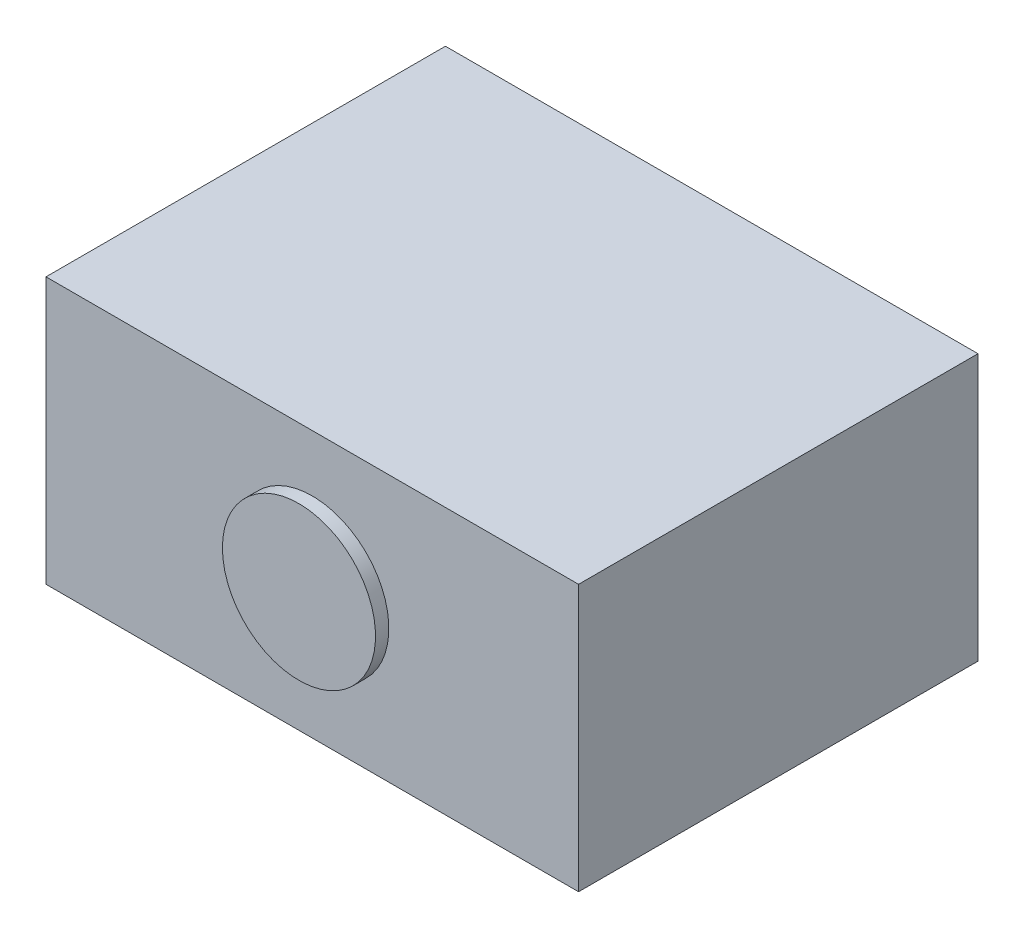
ISO-10303-21;
HEADER;
FILE_DESCRIPTION(('STEP AP214'),'2;1');
FILE_NAME('part.step','',(''),(''),'','','');
FILE_SCHEMA(('AUTOMOTIVE_DESIGN { 1 0 10303 214 1 1 1 1 }'));
ENDSEC;
DATA;
#1=APPLICATION_CONTEXT('core data for automotive mechanical design processes');
#2=APPLICATION_PROTOCOL_DEFINITION('international standard','automotive_design',2000,#1);
#3=PRODUCT_CONTEXT('',#1,'mechanical');
#4=PRODUCT('Part','Part','',(#3));
#5=PRODUCT_RELATED_PRODUCT_CATEGORY('part','',(#4));
#6=PRODUCT_DEFINITION_FORMATION('','',#4);
#7=PRODUCT_DEFINITION_CONTEXT('part definition',#1,'design');
#8=PRODUCT_DEFINITION('design','',#6,#7);
#9=PRODUCT_DEFINITION_SHAPE('','',#8);
#10=(LENGTH_UNIT() NAMED_UNIT(*) SI_UNIT(.MILLI.,.METRE.));
#11=(NAMED_UNIT(*) PLANE_ANGLE_UNIT() SI_UNIT($,.RADIAN.));
#12=(NAMED_UNIT(*) SI_UNIT($,.STERADIAN.) SOLID_ANGLE_UNIT());
#13=UNCERTAINTY_MEASURE_WITH_UNIT(LENGTH_MEASURE(1.E-05),#10,'distance_accuracy_value','');
#14=(GEOMETRIC_REPRESENTATION_CONTEXT(3) GLOBAL_UNCERTAINTY_ASSIGNED_CONTEXT((#13)) GLOBAL_UNIT_ASSIGNED_CONTEXT((#10,
#11,#12)) REPRESENTATION_CONTEXT('',''));
#15=CARTESIAN_POINT('',(0.,0.,0.));
#16=DIRECTION('',(0.,0.,1.));
#17=DIRECTION('',(1.,0.,0.));
#18=AXIS2_PLACEMENT_3D('',#15,#16,#17);
#19=CARTESIAN_POINT('',(200.,-100.,-150.));
#20=DIRECTION('',(1.,0.,0.));
#21=DIRECTION('',(0.,0.,-1.));
#22=AXIS2_PLACEMENT_3D('',#19,#20,#21);
#23=PLANE('',#22);
#24=DIRECTION('',(0.,0.,1.));
#25=VECTOR('',#24,1.);
#26=CARTESIAN_POINT('',(200.,100.,-150.));
#27=LINE('',#26,#25);
#28=CARTESIAN_POINT('',(200.,100.,-150.));
#29=VERTEX_POINT('',#28);
#30=CARTESIAN_POINT('',(200.,100.,150.));
#31=VERTEX_POINT('',#30);
#32=EDGE_CURVE('E73',#29,#31,#27,.T.);
#33=ORIENTED_EDGE('',*,*,#32,.T.);
#34=DIRECTION('',(0.,1.,0.));
#35=VECTOR('',#34,1.);
#36=CARTESIAN_POINT('',(200.,-100.,150.));
#37=LINE('',#36,#35);
#38=CARTESIAN_POINT('',(200.,-100.,150.));
#39=VERTEX_POINT('',#38);
#40=EDGE_CURVE('E76',#39,#31,#37,.T.);
#41=ORIENTED_EDGE('',*,*,#40,.F.);
#42=DIRECTION('',(0.,0.,1.));
#43=VECTOR('',#42,1.);
#44=CARTESIAN_POINT('',(200.,-100.,-150.));
#45=LINE('',#44,#43);
#46=CARTESIAN_POINT('',(200.,-100.,-150.));
#47=VERTEX_POINT('',#46);
#48=EDGE_CURVE('E41',#47,#39,#45,.T.);
#49=ORIENTED_EDGE('',*,*,#48,.F.);
#50=DIRECTION('',(0.,1.,0.));
#51=VECTOR('',#50,1.);
#52=CARTESIAN_POINT('',(200.,-100.,-150.));
#53=LINE('',#52,#51);
#54=EDGE_CURVE('E77',#47,#29,#53,.T.);
#55=ORIENTED_EDGE('',*,*,#54,.T.);
#56=EDGE_LOOP('',(#33,#41,#49,#55));
#57=FACE_BOUND('',#56,.T.);
#58=ADVANCED_FACE('F33',(#57),#23,.T.);
#59=CARTESIAN_POINT('',(-200.,-100.,-150.));
#60=DIRECTION('',(0.,-1.,0.));
#61=DIRECTION('',(0.,0.,-1.));
#62=AXIS2_PLACEMENT_3D('',#59,#60,#61);
#63=PLANE('',#62);
#64=ORIENTED_EDGE('',*,*,#48,.T.);
#65=DIRECTION('',(1.,0.,0.));
#66=VECTOR('',#65,1.);
#67=CARTESIAN_POINT('',(-200.,-100.,150.));
#68=LINE('',#67,#66);
#69=CARTESIAN_POINT('',(-200.,-100.,150.));
#70=VERTEX_POINT('',#69);
#71=EDGE_CURVE('E93',#70,#39,#68,.T.);
#72=ORIENTED_EDGE('',*,*,#71,.F.);
#73=DIRECTION('',(0.,0.,1.));
#74=VECTOR('',#73,1.);
#75=CARTESIAN_POINT('',(-200.,-100.,-150.));
#76=LINE('',#75,#74);
#77=CARTESIAN_POINT('',(-200.,-100.,-150.));
#78=VERTEX_POINT('',#77);
#79=EDGE_CURVE('E56',#78,#70,#76,.T.);
#80=ORIENTED_EDGE('',*,*,#79,.F.);
#81=DIRECTION('',(1.,0.,0.));
#82=VECTOR('',#81,1.);
#83=CARTESIAN_POINT('',(-200.,-100.,-150.));
#84=LINE('',#83,#82);
#85=EDGE_CURVE('E82',#78,#47,#84,.T.);
#86=ORIENTED_EDGE('',*,*,#85,.T.);
#87=EDGE_LOOP('',(#64,#72,#80,#86));
#88=FACE_BOUND('',#87,.T.);
#89=ADVANCED_FACE('F113',(#88),#63,.T.);
#90=CARTESIAN_POINT('',(-200.,-100.,-150.));
#91=DIRECTION('',(-1.,0.,0.));
#92=DIRECTION('',(0.,0.,1.));
#93=AXIS2_PLACEMENT_3D('',#90,#91,#92);
#94=PLANE('',#93);
#95=ORIENTED_EDGE('',*,*,#79,.T.);
#96=DIRECTION('',(0.,-1.,0.));
#97=VECTOR('',#96,1.);
#98=CARTESIAN_POINT('',(-200.,-100.,150.));
#99=LINE('',#98,#97);
#100=CARTESIAN_POINT('',(-200.,100.,150.));
#101=VERTEX_POINT('',#100);
#102=EDGE_CURVE('E89',#101,#70,#99,.T.);
#103=ORIENTED_EDGE('',*,*,#102,.F.);
#104=DIRECTION('',(0.,0.,1.));
#105=VECTOR('',#104,1.);
#106=CARTESIAN_POINT('',(-200.,100.,-150.));
#107=LINE('',#106,#105);
#108=CARTESIAN_POINT('',(-200.,100.,-150.));
#109=VERTEX_POINT('',#108);
#110=EDGE_CURVE('E81',#109,#101,#107,.T.);
#111=ORIENTED_EDGE('',*,*,#110,.F.);
#112=DIRECTION('',(0.,-1.,0.));
#113=VECTOR('',#112,1.);
#114=CARTESIAN_POINT('',(-200.,-100.,-150.));
#115=LINE('',#114,#113);
#116=EDGE_CURVE('E104',#109,#78,#115,.T.);
#117=ORIENTED_EDGE('',*,*,#116,.T.);
#118=EDGE_LOOP('',(#95,#103,#111,#117));
#119=FACE_BOUND('',#118,.T.);
#120=ADVANCED_FACE('F110',(#119),#94,.T.);
#121=CARTESIAN_POINT('',(-200.,100.,-150.));
#122=DIRECTION('',(0.,1.,0.));
#123=DIRECTION('',(0.,0.,1.));
#124=AXIS2_PLACEMENT_3D('',#121,#122,#123);
#125=PLANE('',#124);
#126=ORIENTED_EDGE('',*,*,#110,.T.);
#127=DIRECTION('',(-1.,0.,0.));
#128=VECTOR('',#127,1.);
#129=CARTESIAN_POINT('',(-200.,100.,150.));
#130=LINE('',#129,#128);
#131=EDGE_CURVE('E84',#31,#101,#130,.T.);
#132=ORIENTED_EDGE('',*,*,#131,.F.);
#133=ORIENTED_EDGE('',*,*,#32,.F.);
#134=DIRECTION('',(-1.,0.,0.));
#135=VECTOR('',#134,1.);
#136=CARTESIAN_POINT('',(-200.,100.,-150.));
#137=LINE('',#136,#135);
#138=EDGE_CURVE('E102',#29,#109,#137,.T.);
#139=ORIENTED_EDGE('',*,*,#138,.T.);
#140=EDGE_LOOP('',(#126,#132,#133,#139));
#141=FACE_BOUND('',#140,.T.);
#142=ADVANCED_FACE('F85',(#141),#125,.T.);
#143=CARTESIAN_POINT('',(0.,0.,-150.));
#144=DIRECTION('',(0.,0.,-1.));
#145=DIRECTION('',(-1.,0.,0.));
#146=AXIS2_PLACEMENT_3D('',#143,#144,#145);
#147=PLANE('',#146);
#148=CARTESIAN_POINT('',(0.,0.,-150.));
#149=DIRECTION('',(0.,0.,-1.));
#150=DIRECTION('',(-1.,0.,0.));
#151=AXIS2_PLACEMENT_3D('',#148,#149,#150);
#152=CIRCLE('',#151,57.5);
#153=CARTESIAN_POINT('',(-57.5,0.,-150.));
#154=VERTEX_POINT('',#153);
#155=EDGE_CURVE('E11',#154,#154,#152,.T.);
#156=ORIENTED_EDGE('',*,*,#155,.F.);
#157=EDGE_LOOP('',(#156));
#158=FACE_BOUND('',#157,.T.);
#159=ORIENTED_EDGE('',*,*,#54,.F.);
#160=ORIENTED_EDGE('',*,*,#85,.F.);
#161=ORIENTED_EDGE('',*,*,#116,.F.);
#162=ORIENTED_EDGE('',*,*,#138,.F.);
#163=EDGE_LOOP('',(#159,#160,#161,#162));
#164=FACE_BOUND('',#163,.T.);
#165=ADVANCED_FACE('F115',(#158,#164),#147,.T.);
#166=CARTESIAN_POINT('',(0.,0.,150.));
#167=DIRECTION('',(0.,0.,-1.));
#168=DIRECTION('',(-1.,0.,0.));
#169=AXIS2_PLACEMENT_3D('',#166,#167,#168);
#170=PLANE('',#169);
#171=CARTESIAN_POINT('',(0.,0.,150.));
#172=DIRECTION('',(0.,0.,-1.));
#173=DIRECTION('',(-1.,0.,0.));
#174=AXIS2_PLACEMENT_3D('',#171,#172,#173);
#175=CIRCLE('',#174,57.5);
#176=CARTESIAN_POINT('',(-57.5,0.,150.));
#177=VERTEX_POINT('',#176);
#178=EDGE_CURVE('E36',#177,#177,#175,.T.);
#179=ORIENTED_EDGE('',*,*,#178,.T.);
#180=EDGE_LOOP('',(#179));
#181=FACE_BOUND('',#180,.T.);
#182=ORIENTED_EDGE('',*,*,#40,.T.);
#183=ORIENTED_EDGE('',*,*,#131,.T.);
#184=ORIENTED_EDGE('',*,*,#102,.T.);
#185=ORIENTED_EDGE('',*,*,#71,.T.);
#186=EDGE_LOOP('',(#182,#183,#184,#185));
#187=FACE_BOUND('',#186,.T.);
#188=ADVANCED_FACE('F92',(#181,#187),#170,.F.);
#189=CARTESIAN_POINT('',(0.,0.,160.));
#190=DIRECTION('',(0.,0.,-1.));
#191=DIRECTION('',(-1.,0.,0.));
#192=AXIS2_PLACEMENT_3D('',#189,#190,#191);
#193=PLANE('',#192);
#194=CARTESIAN_POINT('',(0.,0.,160.));
#195=DIRECTION('',(0.,0.,-1.));
#196=DIRECTION('',(-1.,0.,0.));
#197=AXIS2_PLACEMENT_3D('',#194,#195,#196);
#198=CIRCLE('',#197,57.5);
#199=CARTESIAN_POINT('',(-57.5,0.,160.));
#200=VERTEX_POINT('',#199);
#201=EDGE_CURVE('E96',#200,#200,#198,.T.);
#202=ORIENTED_EDGE('',*,*,#201,.F.);
#203=EDGE_LOOP('',(#202));
#204=FACE_BOUND('',#203,.T.);
#205=ADVANCED_FACE('F123',(#204),#193,.F.);
#206=CARTESIAN_POINT('',(0.,0.,160.));
#207=DIRECTION('',(0.,0.,-1.));
#208=DIRECTION('',(-1.,0.,0.));
#209=AXIS2_PLACEMENT_3D('',#206,#207,#208);
#210=CYLINDRICAL_SURFACE('',#209,57.5);
#211=ORIENTED_EDGE('',*,*,#201,.T.);
#212=EDGE_LOOP('',(#211));
#213=FACE_BOUND('',#212,.T.);
#214=ORIENTED_EDGE('',*,*,#178,.F.);
#215=EDGE_LOOP('',(#214));
#216=FACE_BOUND('',#215,.T.);
#217=ADVANCED_FACE('F161',(#213,#216),#210,.T.);
#218=ORIENTED_EDGE('',*,*,#155,.T.);
#219=EDGE_LOOP('',(#218));
#220=FACE_BOUND('',#219,.T.);
#221=CARTESIAN_POINT('',(0.,0.,-160.));
#222=DIRECTION('',(0.,0.,-1.));
#223=DIRECTION('',(-1.,0.,0.));
#224=AXIS2_PLACEMENT_3D('',#221,#222,#223);
#225=CIRCLE('',#224,57.5);
#226=CARTESIAN_POINT('',(-57.5,0.,-160.));
#227=VERTEX_POINT('',#226);
#228=EDGE_CURVE('E196',#227,#227,#225,.T.);
#229=ORIENTED_EDGE('',*,*,#228,.F.);
#230=EDGE_LOOP('',(#229));
#231=FACE_BOUND('',#230,.T.);
#232=ADVANCED_FACE('F171',(#220,#231),#210,.T.);
#233=CARTESIAN_POINT('',(0.,0.,-160.));
#234=DIRECTION('',(0.,0.,-1.));
#235=DIRECTION('',(-1.,0.,0.));
#236=AXIS2_PLACEMENT_3D('',#233,#234,#235);
#237=PLANE('',#236);
#238=ORIENTED_EDGE('',*,*,#228,.T.);
#239=EDGE_LOOP('',(#238));
#240=FACE_BOUND('',#239,.T.);
#241=ADVANCED_FACE('F181',(#240),#237,.T.);
#242=CLOSED_SHELL('',(#58,#89,#120,#142,#165,#188,#205,#217,#232,#241));
#243=MANIFOLD_SOLID_BREP('B2',#242);
#244=ADVANCED_BREP_SHAPE_REPRESENTATION('',(#18,#243),#14);
#245=SHAPE_DEFINITION_REPRESENTATION(#9,#244);
ENDSEC;
END-ISO-10303-21;
